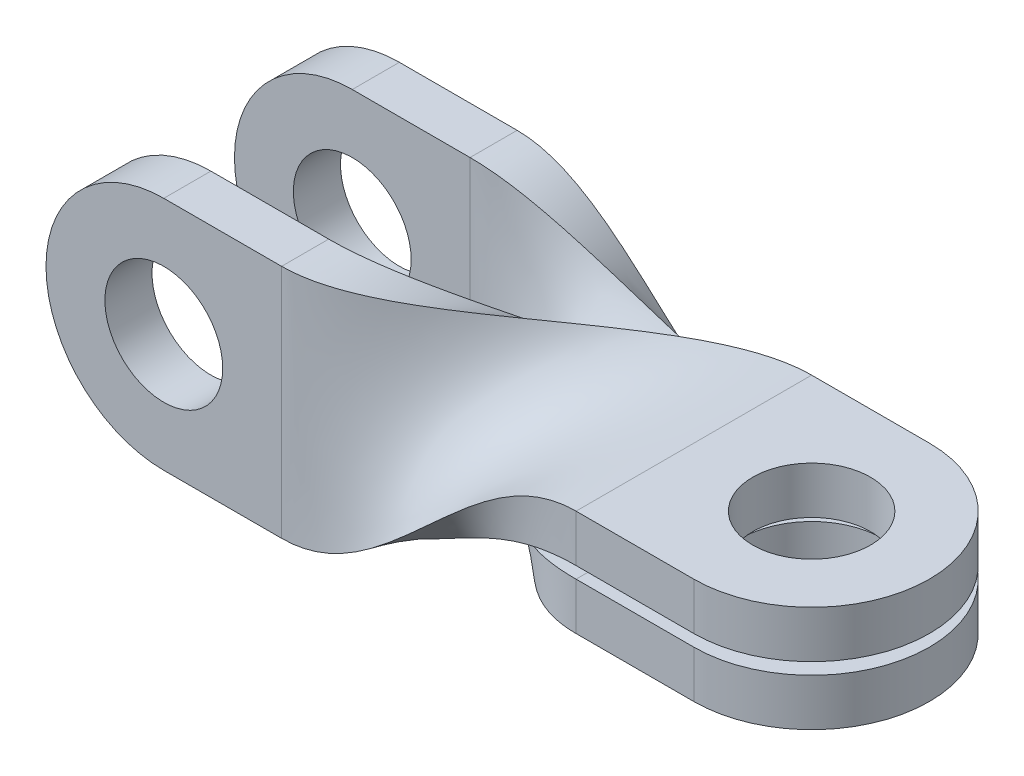
ISO-10303-21;
HEADER;
FILE_DESCRIPTION(('STEP AP214'),'2;1');
FILE_NAME('part.step','',(''),(''),'','','');
FILE_SCHEMA(('AUTOMOTIVE_DESIGN { 1 0 10303 214 1 1 1 1 }'));
ENDSEC;
DATA;
#1=APPLICATION_CONTEXT('core data for automotive mechanical design processes');
#2=APPLICATION_PROTOCOL_DEFINITION('international standard','automotive_design',2000,#1);
#3=PRODUCT_CONTEXT('',#1,'mechanical');
#4=PRODUCT('Part','Part','',(#3));
#5=PRODUCT_RELATED_PRODUCT_CATEGORY('part','',(#4));
#6=PRODUCT_DEFINITION_FORMATION('','',#4);
#7=PRODUCT_DEFINITION_CONTEXT('part definition',#1,'design');
#8=PRODUCT_DEFINITION('design','',#6,#7);
#9=PRODUCT_DEFINITION_SHAPE('','',#8);
#10=(LENGTH_UNIT() NAMED_UNIT(*) SI_UNIT(.MILLI.,.METRE.));
#11=(NAMED_UNIT(*) PLANE_ANGLE_UNIT() SI_UNIT($,.RADIAN.));
#12=(NAMED_UNIT(*) SI_UNIT($,.STERADIAN.) SOLID_ANGLE_UNIT());
#13=UNCERTAINTY_MEASURE_WITH_UNIT(LENGTH_MEASURE(1.E-05),#10,'distance_accuracy_value','');
#14=(GEOMETRIC_REPRESENTATION_CONTEXT(3) GLOBAL_UNCERTAINTY_ASSIGNED_CONTEXT((#13)) GLOBAL_UNIT_ASSIGNED_CONTEXT((#10,
#11,#12)) REPRESENTATION_CONTEXT('',''));
#15=CARTESIAN_POINT('',(0.,0.,0.));
#16=DIRECTION('',(0.,0.,1.));
#17=DIRECTION('',(1.,0.,0.));
#18=AXIS2_PLACEMENT_3D('',#15,#16,#17);
#19=CARTESIAN_POINT('',(0.,-0.5,0.));
#20=DIRECTION('',(0.,1.,0.));
#21=DIRECTION('',(0.,0.,1.));
#22=AXIS2_PLACEMENT_3D('',#19,#20,#21);
#23=CYLINDRICAL_SURFACE('',#22,1.);
#24=CARTESIAN_POINT('',(0.,-0.1,0.));
#25=DIRECTION('',(0.,1.,0.));
#26=DIRECTION('',(0.,0.,1.));
#27=AXIS2_PLACEMENT_3D('',#24,#25,#26);
#28=CIRCLE('',#27,1.);
#29=CARTESIAN_POINT('',(0.,-0.1,1.));
#30=VERTEX_POINT('',#29);
#31=CARTESIAN_POINT('',(0.,-0.1,-1.));
#32=VERTEX_POINT('',#31);
#33=EDGE_CURVE('E594',#30,#32,#28,.T.);
#34=ORIENTED_EDGE('',*,*,#33,.F.);
#35=DIRECTION('',(0.,1.,0.));
#36=VECTOR('',#35,1.);
#37=CARTESIAN_POINT('',(0.,-0.5,1.));
#38=LINE('',#37,#36);
#39=CARTESIAN_POINT('',(0.,-0.5,1.));
#40=VERTEX_POINT('',#39);
#41=EDGE_CURVE('E14',#40,#30,#38,.T.);
#42=ORIENTED_EDGE('',*,*,#41,.F.);
#43=CARTESIAN_POINT('',(0.,-0.5,0.));
#44=DIRECTION('',(0.,1.,0.));
#45=DIRECTION('',(0.,0.,1.));
#46=AXIS2_PLACEMENT_3D('',#43,#44,#45);
#47=CIRCLE('',#46,1.);
#48=CARTESIAN_POINT('',(0.,-0.5,-1.));
#49=VERTEX_POINT('',#48);
#50=EDGE_CURVE('E582',#40,#49,#47,.T.);
#51=ORIENTED_EDGE('',*,*,#50,.T.);
#52=DIRECTION('',(0.,1.,0.));
#53=VECTOR('',#52,1.);
#54=CARTESIAN_POINT('',(0.,-0.5,-1.));
#55=LINE('',#54,#53);
#56=EDGE_CURVE('E570',#49,#32,#55,.T.);
#57=ORIENTED_EDGE('',*,*,#56,.T.);
#58=EDGE_LOOP('',(#34,#42,#51,#57));
#59=FACE_BOUND('',#58,.T.);
#60=ADVANCED_FACE('F526',(#59),#23,.T.);
#61=CARTESIAN_POINT('',(-1.,-0.5,1.));
#62=DIRECTION('',(0.,0.,1.));
#63=DIRECTION('',(1.,0.,0.));
#64=AXIS2_PLACEMENT_3D('',#61,#62,#63);
#65=PLANE('',#64);
#66=DIRECTION('',(1.,0.,0.));
#67=VECTOR('',#66,1.);
#68=CARTESIAN_POINT('',(-1.,-0.1,1.));
#69=LINE('',#68,#67);
#70=CARTESIAN_POINT('',(-1.,-0.1,1.));
#71=VERTEX_POINT('',#70);
#72=EDGE_CURVE('E585',#71,#30,#69,.T.);
#73=ORIENTED_EDGE('',*,*,#72,.F.);
#74=DIRECTION('',(0.,1.,0.));
#75=VECTOR('',#74,1.);
#76=CARTESIAN_POINT('',(-1.,-0.5,1.));
#77=LINE('',#76,#75);
#78=CARTESIAN_POINT('',(-1.,-0.5,1.));
#79=VERTEX_POINT('',#78);
#80=EDGE_CURVE('E536',#79,#71,#77,.T.);
#81=ORIENTED_EDGE('',*,*,#80,.F.);
#82=DIRECTION('',(1.,0.,0.));
#83=VECTOR('',#82,1.);
#84=CARTESIAN_POINT('',(-1.,-0.5,1.));
#85=LINE('',#84,#83);
#86=EDGE_CURVE('E579',#79,#40,#85,.T.);
#87=ORIENTED_EDGE('',*,*,#86,.T.);
#88=ORIENTED_EDGE('',*,*,#41,.T.);
#89=EDGE_LOOP('',(#73,#81,#87,#88));
#90=FACE_BOUND('',#89,.T.);
#91=ADVANCED_FACE('F839',(#90),#65,.T.);
#92=CARTESIAN_POINT('',(0.,-0.5,-1.));
#93=DIRECTION('',(0.,0.,-1.));
#94=DIRECTION('',(-1.,0.,0.));
#95=AXIS2_PLACEMENT_3D('',#92,#93,#94);
#96=PLANE('',#95);
#97=DIRECTION('',(-1.,0.,0.));
#98=VECTOR('',#97,1.);
#99=CARTESIAN_POINT('',(0.,-0.1,-1.));
#100=LINE('',#99,#98);
#101=CARTESIAN_POINT('',(-1.,-0.100000000000001,-0.999999999999999));
#102=VERTEX_POINT('',#101);
#103=EDGE_CURVE('E576',#32,#102,#100,.T.);
#104=ORIENTED_EDGE('',*,*,#103,.F.);
#105=ORIENTED_EDGE('',*,*,#56,.F.);
#106=DIRECTION('',(-1.,0.,0.));
#107=VECTOR('',#106,1.);
#108=CARTESIAN_POINT('',(0.,-0.5,-1.));
#109=LINE('',#108,#107);
#110=CARTESIAN_POINT('',(-1.,-0.5,-0.999999999999999));
#111=VERTEX_POINT('',#110);
#112=EDGE_CURVE('E573',#49,#111,#109,.T.);
#113=ORIENTED_EDGE('',*,*,#112,.T.);
#114=DIRECTION('',(0.,1.,0.));
#115=VECTOR('',#114,1.);
#116=CARTESIAN_POINT('',(-1.,-0.5,-1.));
#117=LINE('',#116,#115);
#118=EDGE_CURVE('E578',#111,#102,#117,.T.);
#119=ORIENTED_EDGE('',*,*,#118,.T.);
#120=EDGE_LOOP('',(#104,#105,#113,#119));
#121=FACE_BOUND('',#120,.T.);
#122=ADVANCED_FACE('F571',(#121),#96,.T.);
#123=CARTESIAN_POINT('',(0.,-0.5,0.));
#124=DIRECTION('',(0.,1.,0.));
#125=DIRECTION('',(0.,0.,1.));
#126=AXIS2_PLACEMENT_3D('',#123,#124,#125);
#127=PLANE('',#126);
#128=CARTESIAN_POINT('',(0.,-0.5,0.));
#129=DIRECTION('',(0.,1.,0.));
#130=DIRECTION('',(0.,0.,1.));
#131=AXIS2_PLACEMENT_3D('',#128,#129,#130);
#132=CIRCLE('',#131,0.6);
#133=CARTESIAN_POINT('',(0.,-0.5,0.6));
#134=VERTEX_POINT('',#133);
#135=EDGE_CURVE('E595',#134,#134,#132,.T.);
#136=ORIENTED_EDGE('',*,*,#135,.T.);
#137=EDGE_LOOP('',(#136));
#138=FACE_BOUND('',#137,.T.);
#139=ORIENTED_EDGE('',*,*,#50,.F.);
#140=ORIENTED_EDGE('',*,*,#86,.F.);
#141=DIRECTION('',(0.,0.,1.));
#142=VECTOR('',#141,1.);
#143=CARTESIAN_POINT('',(-1.,-0.5,0.));
#144=LINE('',#143,#142);
#145=EDGE_CURVE('E565',#111,#79,#144,.T.);
#146=ORIENTED_EDGE('',*,*,#145,.F.);
#147=ORIENTED_EDGE('',*,*,#112,.F.);
#148=EDGE_LOOP('',(#139,#140,#146,#147));
#149=FACE_BOUND('',#148,.T.);
#150=ADVANCED_FACE('F581',(#138,#149),#127,.F.);
#151=CARTESIAN_POINT('',(0.,-0.1,0.));
#152=DIRECTION('',(0.,1.,0.));
#153=DIRECTION('',(0.,0.,1.));
#154=AXIS2_PLACEMENT_3D('',#151,#152,#153);
#155=PLANE('',#154);
#156=CARTESIAN_POINT('',(0.,-0.1,0.));
#157=DIRECTION('',(0.,1.,0.));
#158=DIRECTION('',(0.,0.,1.));
#159=AXIS2_PLACEMENT_3D('',#156,#157,#158);
#160=CIRCLE('',#159,0.6);
#161=CARTESIAN_POINT('',(0.,-0.1,0.6));
#162=VERTEX_POINT('',#161);
#163=EDGE_CURVE('E592',#162,#162,#160,.T.);
#164=ORIENTED_EDGE('',*,*,#163,.F.);
#165=EDGE_LOOP('',(#164));
#166=FACE_BOUND('',#165,.T.);
#167=ORIENTED_EDGE('',*,*,#33,.T.);
#168=ORIENTED_EDGE('',*,*,#103,.T.);
#169=DIRECTION('',(0.,0.,1.));
#170=VECTOR('',#169,1.);
#171=CARTESIAN_POINT('',(-1.,-0.1,0.));
#172=LINE('',#171,#170);
#173=EDGE_CURVE('E588',#102,#71,#172,.T.);
#174=ORIENTED_EDGE('',*,*,#173,.T.);
#175=ORIENTED_EDGE('',*,*,#72,.T.);
#176=EDGE_LOOP('',(#167,#168,#174,#175));
#177=FACE_BOUND('',#176,.T.);
#178=ADVANCED_FACE('F837',(#166,#177),#155,.T.);
#179=CARTESIAN_POINT('',(0.,-0.5,0.));
#180=DIRECTION('',(0.,1.,0.));
#181=DIRECTION('',(0.,0.,1.));
#182=AXIS2_PLACEMENT_3D('',#179,#180,#181);
#183=CYLINDRICAL_SURFACE('',#182,0.6);
#184=ORIENTED_EDGE('',*,*,#135,.F.);
#185=EDGE_LOOP('',(#184));
#186=FACE_BOUND('',#185,.T.);
#187=ORIENTED_EDGE('',*,*,#163,.T.);
#188=EDGE_LOOP('',(#187));
#189=FACE_BOUND('',#188,.T.);
#190=ADVANCED_FACE('F789',(#186,#189),#183,.F.);
#191=CARTESIAN_POINT('',(-3.5,0.949999999999999,-1.));
#192=CARTESIAN_POINT('',(-2.58865282600193,0.95,-1.));
#193=CARTESIAN_POINT('',(-1.91134717399807,-0.5,-0.999999999999999));
#194=CARTESIAN_POINT('',(-1.,-0.5,-1.));
#195=CARTESIAN_POINT('',(-3.5,0.949999999999999,-0.933333333333333));
#196=CARTESIAN_POINT('',(-2.59495036780708,0.95,-0.933333333333333));
#197=CARTESIAN_POINT('',(-1.90504963219292,-0.433333333333333,-0.999999999999999));
#198=CARTESIAN_POINT('',(-1.,-0.433333333333333,-1.));
#199=CARTESIAN_POINT('',(-3.5,0.949999999999999,-0.8));
#200=CARTESIAN_POINT('',(-2.60754545141739,0.95,-0.8));
#201=CARTESIAN_POINT('',(-1.89245454858261,-0.3,-0.999999999999999));
#202=CARTESIAN_POINT('',(-1.,-0.3,-1.));
#203=CARTESIAN_POINT('',(-3.5,0.949999999999999,-0.666666666666667));
#204=CARTESIAN_POINT('',(-2.61484039295249,0.95,-0.666666666666667));
#205=CARTESIAN_POINT('',(-1.88515960704751,-0.166666666666667,-0.999999999999999));
#206=CARTESIAN_POINT('',(-1.,-0.166666666666667,-1.));
#207=CARTESIAN_POINT('',(-3.5,0.949999999999999,-0.6));
#208=CARTESIAN_POINT('',(-2.61848786372004,0.95,-0.6));
#209=CARTESIAN_POINT('',(-1.88151213627996,-0.1,-0.999999999999999));
#210=CARTESIAN_POINT('',(-1.,-0.1,-1.));
#211=B_SPLINE_SURFACE_WITH_KNOTS('',3,3,((#191,#192,#193,#194),(#195,#196,#197,#198),(#199,#200,
#201,#202),(#203,#204,#205,#206),(#207,#208,#209,#210)),.UNSPECIFIED.,.F.,.F.,.F.,(4,1,4),(4,4),
(0.,0.5,1.),(0.,1.),.UNSPECIFIED.);
#212=DIRECTION('',(0.,0.,1.));
#213=VECTOR('',#212,1.);
#214=CARTESIAN_POINT('',(-3.5,0.949999999999999,-1.));
#215=LINE('',#214,#213);
#216=CARTESIAN_POINT('',(-3.5,0.949999999999999,-1.));
#217=VERTEX_POINT('',#216);
#218=CARTESIAN_POINT('',(-3.5,0.949999999999999,-0.6));
#219=VERTEX_POINT('',#218);
#220=EDGE_CURVE('E662',#217,#219,#215,.T.);
#221=CARTESIAN_POINT('',(-3.5,0.949999999999999,-0.6));
#222=CARTESIAN_POINT('',(-2.61848786372004,0.95,-0.6));
#223=CARTESIAN_POINT('',(-1.88151213627996,-0.1,-0.999999999999999));
#224=CARTESIAN_POINT('',(-1.,-0.1,-1.));
#225=B_SPLINE_CURVE_WITH_KNOTS('',3,(#221,#222,#223,#224),.UNSPECIFIED.,.F.,.F.,(4,4),(0.,1.),.UNSPECIFIED.);
#226=EDGE_CURVE('E729',#219,#102,#225,.T.);
#227=CARTESIAN_POINT('',(-3.5,0.949999999999999,-1.));
#228=CARTESIAN_POINT('',(-2.58865282600193,0.95,-1.));
#229=CARTESIAN_POINT('',(-1.91134717399807,-0.5,-0.999999999999999));
#230=CARTESIAN_POINT('',(-1.,-0.5,-1.));
#231=B_SPLINE_CURVE_WITH_KNOTS('',3,(#227,#228,#229,#230),.UNSPECIFIED.,.F.,.F.,(4,4),(0.,1.),.UNSPECIFIED.);
#232=EDGE_CURVE('E671',#111,#217,#231,.F.);
#233=ORIENTED_EDGE('',*,*,#220,.T.);
#234=ORIENTED_EDGE('',*,*,#226,.T.);
#235=ORIENTED_EDGE('',*,*,#118,.F.);
#236=ORIENTED_EDGE('',*,*,#232,.T.);
#237=EDGE_LOOP('',(#233,#234,#235,#236));
#238=FACE_BOUND('',#237,.T.);
#239=ADVANCED_FACE('F650',(#238),#211,.T.);
#240=CARTESIAN_POINT('',(-3.5,0.949999999999999,-0.6));
#241=CARTESIAN_POINT('',(-2.61848786372004,0.95,-0.6));
#242=CARTESIAN_POINT('',(-1.88151213627996,-0.1,-0.999999999999999));
#243=CARTESIAN_POINT('',(-1.,-0.1,-1.));
#244=CARTESIAN_POINT('',(-3.5,0.616666666666666,-0.6));
#245=CARTESIAN_POINT('',(-2.64168935434281,0.616666666666666,-0.6));
#246=CARTESIAN_POINT('',(-1.85831064565719,-0.1,-0.666666666666666));
#247=CARTESIAN_POINT('',(-1.,-0.1,-0.666666666666666));
#248=CARTESIAN_POINT('',(-3.5,-0.0500000000000006,-0.6));
#249=CARTESIAN_POINT('',(-2.68809233558837,-0.0499999999999998,-0.6));
#250=CARTESIAN_POINT('',(-1.81190766441163,-0.1,0.));
#251=CARTESIAN_POINT('',(-1.,-0.1,0.));
#252=CARTESIAN_POINT('',(-3.5,-0.716666666666667,-0.6));
#253=CARTESIAN_POINT('',(-2.5916101018473,-0.716666666666667,-0.6));
#254=CARTESIAN_POINT('',(-1.9083898981527,-0.1,0.666666666666666));
#255=CARTESIAN_POINT('',(-1.,-0.1,0.666666666666666));
#256=CARTESIAN_POINT('',(-3.5,-1.05,-0.6));
#257=CARTESIAN_POINT('',(-2.54336898497677,-1.05,-0.6));
#258=CARTESIAN_POINT('',(-1.95663101502323,-0.1,0.999999999999999));
#259=CARTESIAN_POINT('',(-1.,-0.1,1.));
#260=B_SPLINE_SURFACE_WITH_KNOTS('',3,3,((#240,#241,#242,#243),(#244,#245,#246,#247),(#248,#249,
#250,#251),(#252,#253,#254,#255),(#256,#257,#258,#259)),.UNSPECIFIED.,.F.,.F.,.F.,(4,1,4),(4,4),
(0.,0.5,1.),(0.,1.),.UNSPECIFIED.);
#261=DIRECTION('',(0.,1.,0.));
#262=VECTOR('',#261,1.);
#263=CARTESIAN_POINT('',(-3.5,0.949999999999999,-0.6));
#264=LINE('',#263,#262);
#265=CARTESIAN_POINT('',(-3.5,-1.05,-0.6));
#266=VERTEX_POINT('',#265);
#267=EDGE_CURVE('E529',#266,#219,#264,.T.);
#268=CARTESIAN_POINT('',(-3.5,-1.05,-0.6));
#269=CARTESIAN_POINT('',(-2.54336898497677,-1.05,-0.6));
#270=CARTESIAN_POINT('',(-1.95663101502323,-0.1,0.999999999999999));
#271=CARTESIAN_POINT('',(-1.,-0.1,1.));
#272=B_SPLINE_CURVE_WITH_KNOTS('',3,(#268,#269,#270,#271),.UNSPECIFIED.,.F.,.F.,(4,4),(0.,1.),.UNSPECIFIED.);
#273=EDGE_CURVE('E738',#266,#71,#272,.T.);
#274=ORIENTED_EDGE('',*,*,#267,.F.);
#275=ORIENTED_EDGE('',*,*,#273,.T.);
#276=ORIENTED_EDGE('',*,*,#173,.F.);
#277=ORIENTED_EDGE('',*,*,#226,.F.);
#278=EDGE_LOOP('',(#274,#275,#276,#277));
#279=FACE_BOUND('',#278,.T.);
#280=ADVANCED_FACE('F756',(#279),#260,.T.);
#281=CARTESIAN_POINT('',(-3.5,-1.05,-1.));
#282=CARTESIAN_POINT('',(-2.51697443183543,-1.05,-1.));
#283=CARTESIAN_POINT('',(-1.98302556816456,-0.5,0.999999999999999));
#284=CARTESIAN_POINT('',(-1.,-0.5,1.));
#285=CARTESIAN_POINT('',(-3.5,-0.716666666666667,-1.));
#286=CARTESIAN_POINT('',(-2.5628546758428,-0.716666666666668,-1.));
#287=CARTESIAN_POINT('',(-1.9371453241572,-0.5,0.666666666666666));
#288=CARTESIAN_POINT('',(-1.,-0.5,0.666666666666666));
#289=CARTESIAN_POINT('',(-3.5,-0.0500000000000006,-1.));
#290=CARTESIAN_POINT('',(-2.65461516385754,-0.0500000000000015,-1.));
#291=CARTESIAN_POINT('',(-1.84538483614246,-0.5,0.));
#292=CARTESIAN_POINT('',(-1.,-0.5,0.));
#293=CARTESIAN_POINT('',(-3.5,0.616666666666666,-1.));
#294=CARTESIAN_POINT('',(-2.6106402719538,0.616666666666666,-1.));
#295=CARTESIAN_POINT('',(-1.8893597280462,-0.5,-0.666666666666666));
#296=CARTESIAN_POINT('',(-1.,-0.5,-0.666666666666666));
#297=CARTESIAN_POINT('',(-3.5,0.949999999999999,-1.));
#298=CARTESIAN_POINT('',(-2.58865282600193,0.95,-1.));
#299=CARTESIAN_POINT('',(-1.91134717399807,-0.5,-0.999999999999999));
#300=CARTESIAN_POINT('',(-1.,-0.5,-1.));
#301=B_SPLINE_SURFACE_WITH_KNOTS('',3,3,((#281,#282,#283,#284),(#285,#286,#287,#288),(#289,#290,
#291,#292),(#293,#294,#295,#296),(#297,#298,#299,#300)),.UNSPECIFIED.,.F.,.F.,.F.,(4,1,4),(4,4),
(0.,0.5,1.),(0.,1.),.UNSPECIFIED.);
#302=DIRECTION('',(0.,1.,0.));
#303=VECTOR('',#302,1.);
#304=CARTESIAN_POINT('',(-3.5,0.949999999999999,-1.));
#305=LINE('',#304,#303);
#306=CARTESIAN_POINT('',(-3.5,-1.05,-1.));
#307=VERTEX_POINT('',#306);
#308=EDGE_CURVE('E672',#307,#217,#305,.T.);
#309=CARTESIAN_POINT('',(-3.5,-1.05,-1.));
#310=CARTESIAN_POINT('',(-2.51697443183543,-1.05,-1.));
#311=CARTESIAN_POINT('',(-1.98302556816456,-0.5,1.));
#312=CARTESIAN_POINT('',(-1.,-0.5,1.));
#313=B_SPLINE_CURVE_WITH_KNOTS('',3,(#309,#310,#311,#312),.UNSPECIFIED.,.F.,.F.,(4,4),(0.,1.),.UNSPECIFIED.);
#314=EDGE_CURVE('E801',#307,#79,#313,.T.);
#315=ORIENTED_EDGE('',*,*,#308,.T.);
#316=ORIENTED_EDGE('',*,*,#232,.F.);
#317=ORIENTED_EDGE('',*,*,#145,.T.);
#318=ORIENTED_EDGE('',*,*,#314,.F.);
#319=EDGE_LOOP('',(#315,#316,#317,#318));
#320=FACE_BOUND('',#319,.T.);
#321=ADVANCED_FACE('F766',(#320),#301,.T.);
#322=CARTESIAN_POINT('',(-3.5,-1.05,-0.6));
#323=CARTESIAN_POINT('',(-2.54336898497677,-1.05,-0.6));
#324=CARTESIAN_POINT('',(-1.95663101502323,-0.1,1.));
#325=CARTESIAN_POINT('',(-1.,-0.1,1.));
#326=CARTESIAN_POINT('',(-3.5,-1.05,-0.666666666666667));
#327=CARTESIAN_POINT('',(-2.54016059466707,-1.05,-0.666666666666667));
#328=CARTESIAN_POINT('',(-1.95983940533292,-0.166666666666667,1.));
#329=CARTESIAN_POINT('',(-1.,-0.166666666666667,1.));
#330=CARTESIAN_POINT('',(-3.5,-1.05,-0.8));
#331=CARTESIAN_POINT('',(-2.53374381404769,-1.05,-0.8));
#332=CARTESIAN_POINT('',(-1.96625618595231,-0.3,1.));
#333=CARTESIAN_POINT('',(-1.,-0.3,1.));
#334=CARTESIAN_POINT('',(-3.5,-1.05,-0.933333333333333));
#335=CARTESIAN_POINT('',(-2.52256422590618,-1.05,-0.933333333333333));
#336=CARTESIAN_POINT('',(-1.97743577409381,-0.433333333333333,1.));
#337=CARTESIAN_POINT('',(-1.,-0.433333333333333,1.));
#338=CARTESIAN_POINT('',(-3.5,-1.05,-1.));
#339=CARTESIAN_POINT('',(-2.51697443183543,-1.05,-1.));
#340=CARTESIAN_POINT('',(-1.98302556816456,-0.5,1.));
#341=CARTESIAN_POINT('',(-1.,-0.5,1.));
#342=B_SPLINE_SURFACE_WITH_KNOTS('',3,3,((#322,#323,#324,#325),(#326,#327,#328,#329),(#330,#331,
#332,#333),(#334,#335,#336,#337),(#338,#339,#340,#341)),.UNSPECIFIED.,.F.,.F.,.F.,(4,1,4),(4,4),
(0.,0.5,1.),(0.,1.),.UNSPECIFIED.);
#343=DIRECTION('',(0.,0.,1.));
#344=VECTOR('',#343,1.);
#345=CARTESIAN_POINT('',(-3.5,-1.05,-1.));
#346=LINE('',#345,#344);
#347=EDGE_CURVE('E619',#307,#266,#346,.T.);
#348=ORIENTED_EDGE('',*,*,#347,.F.);
#349=ORIENTED_EDGE('',*,*,#314,.T.);
#350=ORIENTED_EDGE('',*,*,#80,.T.);
#351=ORIENTED_EDGE('',*,*,#273,.F.);
#352=EDGE_LOOP('',(#348,#349,#350,#351));
#353=FACE_BOUND('',#352,.T.);
#354=ADVANCED_FACE('F648',(#353),#342,.T.);
#355=CARTESIAN_POINT('',(-3.5,0.949999999999999,-1.));
#356=DIRECTION('',(0.,1.,0.));
#357=DIRECTION('',(-1.,0.,0.));
#358=AXIS2_PLACEMENT_3D('',#355,#356,#357);
#359=PLANE('',#358);
#360=DIRECTION('',(-1.,0.,0.));
#361=VECTOR('',#360,1.);
#362=CARTESIAN_POINT('',(-3.5,0.949999999999999,-0.6));
#363=LINE('',#362,#361);
#364=CARTESIAN_POINT('',(-4.5,0.95,-0.6));
#365=VERTEX_POINT('',#364);
#366=EDGE_CURVE('E673',#219,#365,#363,.T.);
#367=ORIENTED_EDGE('',*,*,#366,.F.);
#368=ORIENTED_EDGE('',*,*,#220,.F.);
#369=DIRECTION('',(-1.,0.,0.));
#370=VECTOR('',#369,1.);
#371=CARTESIAN_POINT('',(-3.5,0.949999999999999,-1.));
#372=LINE('',#371,#370);
#373=CARTESIAN_POINT('',(-4.5,0.95,-1.));
#374=VERTEX_POINT('',#373);
#375=EDGE_CURVE('E608',#217,#374,#372,.T.);
#376=ORIENTED_EDGE('',*,*,#375,.T.);
#377=DIRECTION('',(0.,0.,1.));
#378=VECTOR('',#377,1.);
#379=CARTESIAN_POINT('',(-4.5,0.95,-1.));
#380=LINE('',#379,#378);
#381=EDGE_CURVE('E705',#374,#365,#380,.T.);
#382=ORIENTED_EDGE('',*,*,#381,.T.);
#383=EDGE_LOOP('',(#367,#368,#376,#382));
#384=FACE_BOUND('',#383,.T.);
#385=ADVANCED_FACE('F637',(#384),#359,.T.);
#386=CARTESIAN_POINT('',(-4.5,-1.05,-1.));
#387=DIRECTION('',(0.,-1.,0.));
#388=DIRECTION('',(1.,0.,0.));
#389=AXIS2_PLACEMENT_3D('',#386,#387,#388);
#390=PLANE('',#389);
#391=DIRECTION('',(1.,0.,0.));
#392=VECTOR('',#391,1.);
#393=CARTESIAN_POINT('',(-4.5,-1.05,-0.6));
#394=LINE('',#393,#392);
#395=CARTESIAN_POINT('',(-4.5,-1.05,-0.6));
#396=VERTEX_POINT('',#395);
#397=EDGE_CURVE('E605',#396,#266,#394,.T.);
#398=ORIENTED_EDGE('',*,*,#397,.F.);
#399=DIRECTION('',(0.,0.,1.));
#400=VECTOR('',#399,1.);
#401=CARTESIAN_POINT('',(-4.5,-1.05,-1.));
#402=LINE('',#401,#400);
#403=CARTESIAN_POINT('',(-4.5,-1.05,-1.));
#404=VERTEX_POINT('',#403);
#405=EDGE_CURVE('E712',#404,#396,#402,.T.);
#406=ORIENTED_EDGE('',*,*,#405,.F.);
#407=DIRECTION('',(1.,0.,0.));
#408=VECTOR('',#407,1.);
#409=CARTESIAN_POINT('',(-4.5,-1.05,-1.));
#410=LINE('',#409,#408);
#411=EDGE_CURVE('E699',#404,#307,#410,.T.);
#412=ORIENTED_EDGE('',*,*,#411,.T.);
#413=ORIENTED_EDGE('',*,*,#347,.T.);
#414=EDGE_LOOP('',(#398,#406,#412,#413));
#415=FACE_BOUND('',#414,.T.);
#416=ADVANCED_FACE('F626',(#415),#390,.T.);
#417=CARTESIAN_POINT('',(-4.5,-0.0500000000000005,-1.));
#418=DIRECTION('',(0.,0.,1.));
#419=DIRECTION('',(1.,0.,0.));
#420=AXIS2_PLACEMENT_3D('',#417,#418,#419);
#421=CYLINDRICAL_SURFACE('',#420,1.);
#422=CARTESIAN_POINT('',(-4.5,-0.0500000000000005,-0.6));
#423=DIRECTION('',(0.,0.,1.));
#424=DIRECTION('',(-1.,0.,0.));
#425=AXIS2_PLACEMENT_3D('',#422,#423,#424);
#426=CIRCLE('',#425,1.);
#427=EDGE_CURVE('E609',#365,#396,#426,.T.);
#428=ORIENTED_EDGE('',*,*,#427,.F.);
#429=ORIENTED_EDGE('',*,*,#381,.F.);
#430=CARTESIAN_POINT('',(-4.5,-0.0500000000000005,-1.));
#431=DIRECTION('',(0.,0.,1.));
#432=DIRECTION('',(-1.,0.,0.));
#433=AXIS2_PLACEMENT_3D('',#430,#431,#432);
#434=CIRCLE('',#433,1.);
#435=EDGE_CURVE('E693',#374,#404,#434,.T.);
#436=ORIENTED_EDGE('',*,*,#435,.T.);
#437=ORIENTED_EDGE('',*,*,#405,.T.);
#438=EDGE_LOOP('',(#428,#429,#436,#437));
#439=FACE_BOUND('',#438,.T.);
#440=ADVANCED_FACE('F636',(#439),#421,.T.);
#441=CARTESIAN_POINT('',(-4.5,-0.0500000000000005,-1.));
#442=DIRECTION('',(0.,0.,-1.));
#443=DIRECTION('',(-1.,0.,0.));
#444=AXIS2_PLACEMENT_3D('',#441,#442,#443);
#445=PLANE('',#444);
#446=CARTESIAN_POINT('',(-4.5,-0.0500000000000005,-1.));
#447=DIRECTION('',(0.,0.,1.));
#448=DIRECTION('',(1.,0.,0.));
#449=AXIS2_PLACEMENT_3D('',#446,#447,#448);
#450=CIRCLE('',#449,0.5);
#451=CARTESIAN_POINT('',(-4.,-0.0500000000000005,-1.));
#452=VERTEX_POINT('',#451);
#453=EDGE_CURVE('E850',#452,#452,#450,.T.);
#454=ORIENTED_EDGE('',*,*,#453,.T.);
#455=EDGE_LOOP('',(#454));
#456=FACE_BOUND('',#455,.T.);
#457=ORIENTED_EDGE('',*,*,#375,.F.);
#458=ORIENTED_EDGE('',*,*,#308,.F.);
#459=ORIENTED_EDGE('',*,*,#411,.F.);
#460=ORIENTED_EDGE('',*,*,#435,.F.);
#461=EDGE_LOOP('',(#457,#458,#459,#460));
#462=FACE_BOUND('',#461,.T.);
#463=ADVANCED_FACE('F643',(#456,#462),#445,.T.);
#464=CARTESIAN_POINT('',(-4.5,-0.0500000000000005,-0.6));
#465=DIRECTION('',(0.,0.,-1.));
#466=DIRECTION('',(-1.,0.,0.));
#467=AXIS2_PLACEMENT_3D('',#464,#465,#466);
#468=PLANE('',#467);
#469=CARTESIAN_POINT('',(-4.5,-0.0500000000000005,-0.6));
#470=DIRECTION('',(0.,0.,1.));
#471=DIRECTION('',(1.,0.,0.));
#472=AXIS2_PLACEMENT_3D('',#469,#470,#471);
#473=CIRCLE('',#472,0.5);
#474=CARTESIAN_POINT('',(-4.,-0.0500000000000005,-0.6));
#475=VERTEX_POINT('',#474);
#476=EDGE_CURVE('E708',#475,#475,#473,.T.);
#477=ORIENTED_EDGE('',*,*,#476,.F.);
#478=EDGE_LOOP('',(#477));
#479=FACE_BOUND('',#478,.T.);
#480=ORIENTED_EDGE('',*,*,#366,.T.);
#481=ORIENTED_EDGE('',*,*,#427,.T.);
#482=ORIENTED_EDGE('',*,*,#397,.T.);
#483=ORIENTED_EDGE('',*,*,#267,.T.);
#484=EDGE_LOOP('',(#480,#481,#482,#483));
#485=FACE_BOUND('',#484,.T.);
#486=ADVANCED_FACE('F638',(#479,#485),#468,.F.);
#487=CARTESIAN_POINT('',(-4.5,-0.0500000000000005,-1.));
#488=DIRECTION('',(0.,0.,1.));
#489=DIRECTION('',(1.,0.,0.));
#490=AXIS2_PLACEMENT_3D('',#487,#488,#489);
#491=CYLINDRICAL_SURFACE('',#490,0.5);
#492=ORIENTED_EDGE('',*,*,#453,.F.);
#493=EDGE_LOOP('',(#492));
#494=FACE_BOUND('',#493,.T.);
#495=ORIENTED_EDGE('',*,*,#476,.T.);
#496=EDGE_LOOP('',(#495));
#497=FACE_BOUND('',#496,.T.);
#498=ADVANCED_FACE('F857',(#494,#497),#491,.F.);
#499=CLOSED_SHELL('',(#60,#91,#122,#150,#178,#190,#239,#280,#321,#354,#385,#416,#440,#463,#486,#498));
#500=MANIFOLD_SOLID_BREP('B2',#499);
#501=CARTESIAN_POINT('',(0.,0.4,0.));
#502=DIRECTION('',(0.,1.,0.));
#503=DIRECTION('',(0.,0.,1.));
#504=AXIS2_PLACEMENT_3D('',#501,#502,#503);
#505=PLANE('',#504);
#506=CARTESIAN_POINT('',(0.,0.4,0.));
#507=DIRECTION('',(0.,1.,0.));
#508=DIRECTION('',(0.,0.,1.));
#509=AXIS2_PLACEMENT_3D('',#506,#507,#508);
#510=CIRCLE('',#509,1.);
#511=CARTESIAN_POINT('',(0.,0.4,1.));
#512=VERTEX_POINT('',#511);
#513=CARTESIAN_POINT('',(0.,0.4,-1.));
#514=VERTEX_POINT('',#513);
#515=EDGE_CURVE('E1305',#512,#514,#510,.T.);
#516=ORIENTED_EDGE('',*,*,#515,.T.);
#517=DIRECTION('',(-1.,0.,0.));
#518=VECTOR('',#517,1.);
#519=CARTESIAN_POINT('',(0.,0.4,-1.));
#520=LINE('',#519,#518);
#521=CARTESIAN_POINT('',(-1.,0.4,-1.));
#522=VERTEX_POINT('',#521);
#523=EDGE_CURVE('E1294',#514,#522,#520,.T.);
#524=ORIENTED_EDGE('',*,*,#523,.T.);
#525=DIRECTION('',(0.,0.,1.));
#526=VECTOR('',#525,1.);
#527=CARTESIAN_POINT('',(-1.,0.4,0.));
#528=LINE('',#527,#526);
#529=CARTESIAN_POINT('',(-1.,0.4,1.));
#530=VERTEX_POINT('',#529);
#531=EDGE_CURVE('E1304',#522,#530,#528,.T.);
#532=ORIENTED_EDGE('',*,*,#531,.T.);
#533=DIRECTION('',(1.,0.,0.));
#534=VECTOR('',#533,1.);
#535=CARTESIAN_POINT('',(-1.,0.4,1.));
#536=LINE('',#535,#534);
#537=EDGE_CURVE('E1275',#530,#512,#536,.T.);
#538=ORIENTED_EDGE('',*,*,#537,.T.);
#539=EDGE_LOOP('',(#516,#524,#532,#538));
#540=FACE_BOUND('',#539,.T.);
#541=CARTESIAN_POINT('',(0.,0.4,0.));
#542=DIRECTION('',(0.,1.,0.));
#543=DIRECTION('',(0.,0.,1.));
#544=AXIS2_PLACEMENT_3D('',#541,#542,#543);
#545=CIRCLE('',#544,0.5);
#546=CARTESIAN_POINT('',(0.,0.4,0.5));
#547=VERTEX_POINT('',#546);
#548=EDGE_CURVE('E1321',#547,#547,#545,.T.);
#549=ORIENTED_EDGE('',*,*,#548,.F.);
#550=EDGE_LOOP('',(#549));
#551=FACE_BOUND('',#550,.T.);
#552=ADVANCED_FACE('F1254',(#540,#551),#505,.T.);
#553=CARTESIAN_POINT('',(0.,0.,0.));
#554=DIRECTION('',(0.,1.,0.));
#555=DIRECTION('',(0.,0.,1.));
#556=AXIS2_PLACEMENT_3D('',#553,#554,#555);
#557=PLANE('',#556);
#558=CARTESIAN_POINT('',(0.,0.,0.));
#559=DIRECTION('',(0.,1.,0.));
#560=DIRECTION('',(0.,0.,1.));
#561=AXIS2_PLACEMENT_3D('',#558,#559,#560);
#562=CIRCLE('',#561,1.);
#563=CARTESIAN_POINT('',(0.,0.,1.));
#564=VERTEX_POINT('',#563);
#565=CARTESIAN_POINT('',(0.,0.,-1.));
#566=VERTEX_POINT('',#565);
#567=EDGE_CURVE('E1315',#564,#566,#562,.T.);
#568=ORIENTED_EDGE('',*,*,#567,.F.);
#569=DIRECTION('',(1.,0.,0.));
#570=VECTOR('',#569,1.);
#571=CARTESIAN_POINT('',(-1.,0.,1.));
#572=LINE('',#571,#570);
#573=CARTESIAN_POINT('',(-1.,0.,1.));
#574=VERTEX_POINT('',#573);
#575=EDGE_CURVE('E1312',#574,#564,#572,.T.);
#576=ORIENTED_EDGE('',*,*,#575,.F.);
#577=DIRECTION('',(0.,0.,1.));
#578=VECTOR('',#577,1.);
#579=CARTESIAN_POINT('',(-1.,0.,0.));
#580=LINE('',#579,#578);
#581=CARTESIAN_POINT('',(-1.,0.,-0.999999999999999));
#582=VERTEX_POINT('',#581);
#583=EDGE_CURVE('E1325',#582,#574,#580,.T.);
#584=ORIENTED_EDGE('',*,*,#583,.F.);
#585=DIRECTION('',(-1.,0.,0.));
#586=VECTOR('',#585,1.);
#587=CARTESIAN_POINT('',(0.,0.,-1.));
#588=LINE('',#587,#586);
#589=EDGE_CURVE('E1320',#566,#582,#588,.T.);
#590=ORIENTED_EDGE('',*,*,#589,.F.);
#591=EDGE_LOOP('',(#568,#576,#584,#590));
#592=FACE_BOUND('',#591,.T.);
#593=CARTESIAN_POINT('',(0.,0.,0.));
#594=DIRECTION('',(0.,1.,0.));
#595=DIRECTION('',(0.,0.,1.));
#596=AXIS2_PLACEMENT_3D('',#593,#594,#595);
#597=CIRCLE('',#596,0.5);
#598=CARTESIAN_POINT('',(0.,0.,0.5));
#599=VERTEX_POINT('',#598);
#600=EDGE_CURVE('E1328',#599,#599,#597,.T.);
#601=ORIENTED_EDGE('',*,*,#600,.T.);
#602=EDGE_LOOP('',(#601));
#603=FACE_BOUND('',#602,.T.);
#604=ADVANCED_FACE('F1492',(#592,#603),#557,.F.);
#605=CARTESIAN_POINT('',(0.,0.4,0.));
#606=DIRECTION('',(0.,-1.,0.));
#607=DIRECTION('',(0.,0.,-1.));
#608=AXIS2_PLACEMENT_3D('',#605,#606,#607);
#609=CYLINDRICAL_SURFACE('',#608,1.);
#610=ORIENTED_EDGE('',*,*,#567,.T.);
#611=DIRECTION('',(0.,-1.,0.));
#612=VECTOR('',#611,1.);
#613=CARTESIAN_POINT('',(0.,0.4,-1.));
#614=LINE('',#613,#612);
#615=EDGE_CURVE('E524',#514,#566,#614,.T.);
#616=ORIENTED_EDGE('',*,*,#615,.F.);
#617=ORIENTED_EDGE('',*,*,#515,.F.);
#618=DIRECTION('',(0.,-1.,0.));
#619=VECTOR('',#618,1.);
#620=CARTESIAN_POINT('',(0.,0.4,1.));
#621=LINE('',#620,#619);
#622=EDGE_CURVE('E1316',#512,#564,#621,.T.);
#623=ORIENTED_EDGE('',*,*,#622,.T.);
#624=EDGE_LOOP('',(#610,#616,#617,#623));
#625=FACE_BOUND('',#624,.T.);
#626=ADVANCED_FACE('F1256',(#625),#609,.T.);
#627=CARTESIAN_POINT('',(0.,0.4,-1.));
#628=DIRECTION('',(0.,0.,1.));
#629=DIRECTION('',(1.,0.,0.));
#630=AXIS2_PLACEMENT_3D('',#627,#628,#629);
#631=PLANE('',#630);
#632=ORIENTED_EDGE('',*,*,#589,.T.);
#633=DIRECTION('',(0.,1.,0.));
#634=VECTOR('',#633,1.);
#635=CARTESIAN_POINT('',(-1.,0.4,-1.));
#636=LINE('',#635,#634);
#637=EDGE_CURVE('E1266',#522,#582,#636,.F.);
#638=ORIENTED_EDGE('',*,*,#637,.F.);
#639=ORIENTED_EDGE('',*,*,#523,.F.);
#640=ORIENTED_EDGE('',*,*,#615,.T.);
#641=EDGE_LOOP('',(#632,#638,#639,#640));
#642=FACE_BOUND('',#641,.T.);
#643=ADVANCED_FACE('F1298',(#642),#631,.F.);
#644=CARTESIAN_POINT('',(-1.,0.4,1.));
#645=DIRECTION('',(0.,0.,-1.));
#646=DIRECTION('',(-1.,0.,0.));
#647=AXIS2_PLACEMENT_3D('',#644,#645,#646);
#648=PLANE('',#647);
#649=ORIENTED_EDGE('',*,*,#575,.T.);
#650=ORIENTED_EDGE('',*,*,#622,.F.);
#651=ORIENTED_EDGE('',*,*,#537,.F.);
#652=DIRECTION('',(0.,1.,0.));
#653=VECTOR('',#652,1.);
#654=CARTESIAN_POINT('',(-1.,0.4,1.));
#655=LINE('',#654,#653);
#656=EDGE_CURVE('E1333',#530,#574,#655,.F.);
#657=ORIENTED_EDGE('',*,*,#656,.T.);
#658=EDGE_LOOP('',(#649,#650,#651,#657));
#659=FACE_BOUND('',#658,.T.);
#660=ADVANCED_FACE('F1549',(#659),#648,.F.);
#661=CARTESIAN_POINT('',(0.,0.4,0.));
#662=DIRECTION('',(0.,-1.,0.));
#663=DIRECTION('',(0.,0.,-1.));
#664=AXIS2_PLACEMENT_3D('',#661,#662,#663);
#665=CYLINDRICAL_SURFACE('',#664,0.5);
#666=ORIENTED_EDGE('',*,*,#548,.T.);
#667=EDGE_LOOP('',(#666));
#668=FACE_BOUND('',#667,.T.);
#669=ORIENTED_EDGE('',*,*,#600,.F.);
#670=EDGE_LOOP('',(#669));
#671=FACE_BOUND('',#670,.T.);
#672=ADVANCED_FACE('F1391',(#668,#671),#665,.F.);
#673=CARTESIAN_POINT('',(-3.5,0.949999999999999,0.6));
#674=CARTESIAN_POINT('',(-2.54336898497677,0.95,0.6));
#675=CARTESIAN_POINT('',(-1.95663101502323,0.,-0.999999999999999));
#676=CARTESIAN_POINT('',(-1.,0.,-1.));
#677=CARTESIAN_POINT('',(-3.5,0.949999999999999,0.666666666666667));
#678=CARTESIAN_POINT('',(-2.54016059466708,0.95,0.666666666666667));
#679=CARTESIAN_POINT('',(-1.95983940533292,0.0666666666666667,-0.999999999999999));
#680=CARTESIAN_POINT('',(-1.,0.0666666666666667,-1.));
#681=CARTESIAN_POINT('',(-3.5,0.949999999999999,0.8));
#682=CARTESIAN_POINT('',(-2.53374381404769,0.95,0.8));
#683=CARTESIAN_POINT('',(-1.96625618595231,0.2,-0.999999999999999));
#684=CARTESIAN_POINT('',(-1.,0.2,-1.));
#685=CARTESIAN_POINT('',(-3.5,0.949999999999999,0.933333333333333));
#686=CARTESIAN_POINT('',(-2.52256422590619,0.95,0.933333333333333));
#687=CARTESIAN_POINT('',(-1.97743577409381,0.333333333333333,-0.999999999999999));
#688=CARTESIAN_POINT('',(-1.,0.333333333333333,-1.));
#689=CARTESIAN_POINT('',(-3.5,0.949999999999999,1.));
#690=CARTESIAN_POINT('',(-2.51697443183543,0.95,1.));
#691=CARTESIAN_POINT('',(-1.98302556816457,0.4,-0.999999999999999));
#692=CARTESIAN_POINT('',(-1.,0.4,-1.));
#693=B_SPLINE_SURFACE_WITH_KNOTS('',3,3,((#673,#674,#675,#676),(#677,#678,#679,#680),(#681,#682,
#683,#684),(#685,#686,#687,#688),(#689,#690,#691,#692)),.UNSPECIFIED.,.F.,.F.,.F.,(4,1,4),(4,4),
(0.,0.5,1.),(0.,1.),.UNSPECIFIED.);
#694=DIRECTION('',(0.,0.,-1.));
#695=VECTOR('',#694,1.);
#696=CARTESIAN_POINT('',(-3.5,0.949999999999999,1.));
#697=LINE('',#696,#695);
#698=CARTESIAN_POINT('',(-3.5,0.949999999999999,1.));
#699=VERTEX_POINT('',#698);
#700=CARTESIAN_POINT('',(-3.5,0.949999999999999,0.6));
#701=VERTEX_POINT('',#700);
#702=EDGE_CURVE('E1363',#699,#701,#697,.T.);
#703=CARTESIAN_POINT('',(-3.5,0.949999999999999,1.));
#704=CARTESIAN_POINT('',(-2.51697443183543,0.95,1.));
#705=CARTESIAN_POINT('',(-1.98302556816457,0.4,-0.999999999999999));
#706=CARTESIAN_POINT('',(-1.,0.4,-1.));
#707=B_SPLINE_CURVE_WITH_KNOTS('',3,(#703,#704,#705,#706),.UNSPECIFIED.,.F.,.F.,(4,4),(0.,1.),.UNSPECIFIED.);
#708=EDGE_CURVE('E1408',#699,#522,#707,.T.);
#709=CARTESIAN_POINT('',(-3.5,0.949999999999999,0.6));
#710=CARTESIAN_POINT('',(-2.54336898497677,0.95,0.6));
#711=CARTESIAN_POINT('',(-1.95663101502323,0.,-0.999999999999999));
#712=CARTESIAN_POINT('',(-1.,0.,-1.));
#713=B_SPLINE_CURVE_WITH_KNOTS('',3,(#709,#710,#711,#712),.UNSPECIFIED.,.F.,.F.,(4,4),(0.,1.),.UNSPECIFIED.);
#714=EDGE_CURVE('E1418',#582,#701,#713,.F.);
#715=ORIENTED_EDGE('',*,*,#702,.F.);
#716=ORIENTED_EDGE('',*,*,#708,.T.);
#717=ORIENTED_EDGE('',*,*,#637,.T.);
#718=ORIENTED_EDGE('',*,*,#714,.T.);
#719=EDGE_LOOP('',(#715,#716,#717,#718));
#720=FACE_BOUND('',#719,.T.);
#721=ADVANCED_FACE('F1384',(#720),#693,.T.);
#722=CARTESIAN_POINT('',(-3.5,0.949999999999999,1.));
#723=CARTESIAN_POINT('',(-2.51697443183543,0.95,1.));
#724=CARTESIAN_POINT('',(-1.98302556816457,0.4,-0.999999999999999));
#725=CARTESIAN_POINT('',(-1.,0.4,-1.));
#726=CARTESIAN_POINT('',(-3.5,0.616666666666666,1.));
#727=CARTESIAN_POINT('',(-2.5628546758428,0.616666666666666,1.));
#728=CARTESIAN_POINT('',(-1.9371453241572,0.4,-0.666666666666666));
#729=CARTESIAN_POINT('',(-1.,0.4,-0.666666666666666));
#730=CARTESIAN_POINT('',(-3.5,-0.0500000000000006,1.));
#731=CARTESIAN_POINT('',(-2.65461516385754,-0.0499999999999998,1.));
#732=CARTESIAN_POINT('',(-1.84538483614246,0.4,0.));
#733=CARTESIAN_POINT('',(-1.,0.4,0.));
#734=CARTESIAN_POINT('',(-3.5,-0.716666666666667,1.));
#735=CARTESIAN_POINT('',(-2.6106402719538,-0.716666666666667,1.));
#736=CARTESIAN_POINT('',(-1.8893597280462,0.4,0.666666666666666));
#737=CARTESIAN_POINT('',(-1.,0.4,0.666666666666666));
#738=CARTESIAN_POINT('',(-3.5,-1.05,1.));
#739=CARTESIAN_POINT('',(-2.58865282600193,-1.05,1.));
#740=CARTESIAN_POINT('',(-1.91134717399807,0.4,0.999999999999999));
#741=CARTESIAN_POINT('',(-1.,0.4,1.));
#742=B_SPLINE_SURFACE_WITH_KNOTS('',3,3,((#722,#723,#724,#725),(#726,#727,#728,#729),(#730,#731,
#732,#733),(#734,#735,#736,#737),(#738,#739,#740,#741)),.UNSPECIFIED.,.F.,.F.,.F.,(4,1,4),(4,4),
(0.,0.5,1.),(0.,1.),.UNSPECIFIED.);
#743=DIRECTION('',(0.,1.,0.));
#744=VECTOR('',#743,1.);
#745=CARTESIAN_POINT('',(-3.5,0.949999999999999,1.));
#746=LINE('',#745,#744);
#747=CARTESIAN_POINT('',(-3.5,-1.05,1.));
#748=VERTEX_POINT('',#747);
#749=EDGE_CURVE('E1433',#748,#699,#746,.T.);
#750=CARTESIAN_POINT('',(-3.5,-1.05,1.));
#751=CARTESIAN_POINT('',(-2.58865282600193,-1.05,1.));
#752=CARTESIAN_POINT('',(-1.91134717399807,0.4,0.999999999999999));
#753=CARTESIAN_POINT('',(-1.,0.4,1.));
#754=B_SPLINE_CURVE_WITH_KNOTS('',3,(#750,#751,#752,#753),.UNSPECIFIED.,.F.,.F.,(4,4),(0.,1.),.UNSPECIFIED.);
#755=EDGE_CURVE('E1417',#748,#530,#754,.T.);
#756=ORIENTED_EDGE('',*,*,#749,.F.);
#757=ORIENTED_EDGE('',*,*,#755,.T.);
#758=ORIENTED_EDGE('',*,*,#531,.F.);
#759=ORIENTED_EDGE('',*,*,#708,.F.);
#760=EDGE_LOOP('',(#756,#757,#758,#759));
#761=FACE_BOUND('',#760,.T.);
#762=ADVANCED_FACE('F1390',(#761),#742,.T.);
#763=CARTESIAN_POINT('',(-3.5,-1.05,0.6));
#764=CARTESIAN_POINT('',(-2.61848786372004,-1.05,0.6));
#765=CARTESIAN_POINT('',(-1.88151213627996,0.,0.999999999999999));
#766=CARTESIAN_POINT('',(-1.,0.,1.));
#767=CARTESIAN_POINT('',(-3.5,-0.716666666666667,0.6));
#768=CARTESIAN_POINT('',(-2.64168935434281,-0.716666666666668,0.6));
#769=CARTESIAN_POINT('',(-1.85831064565718,0.,0.666666666666666));
#770=CARTESIAN_POINT('',(-1.,0.,0.666666666666666));
#771=CARTESIAN_POINT('',(-3.5,-0.0500000000000006,0.6));
#772=CARTESIAN_POINT('',(-2.68809233558837,-0.0500000000000015,0.6));
#773=CARTESIAN_POINT('',(-1.81190766441163,0.,0.));
#774=CARTESIAN_POINT('',(-1.,0.,0.));
#775=CARTESIAN_POINT('',(-3.5,0.616666666666666,0.6));
#776=CARTESIAN_POINT('',(-2.5916101018473,0.616666666666666,0.6));
#777=CARTESIAN_POINT('',(-1.9083898981527,0.,-0.666666666666666));
#778=CARTESIAN_POINT('',(-1.,0.,-0.666666666666666));
#779=CARTESIAN_POINT('',(-3.5,0.949999999999999,0.6));
#780=CARTESIAN_POINT('',(-2.54336898497677,0.95,0.6));
#781=CARTESIAN_POINT('',(-1.95663101502323,0.,-0.999999999999999));
#782=CARTESIAN_POINT('',(-1.,0.,-1.));
#783=B_SPLINE_SURFACE_WITH_KNOTS('',3,3,((#763,#764,#765,#766),(#767,#768,#769,#770),(#771,#772,
#773,#774),(#775,#776,#777,#778),(#779,#780,#781,#782)),.UNSPECIFIED.,.F.,.F.,.F.,(4,1,4),(4,4),
(0.,0.5,1.),(0.,1.),.UNSPECIFIED.);
#784=DIRECTION('',(0.,1.,0.));
#785=VECTOR('',#784,1.);
#786=CARTESIAN_POINT('',(-3.5,0.949999999999999,0.6));
#787=LINE('',#786,#785);
#788=CARTESIAN_POINT('',(-3.5,-1.05,0.6));
#789=VERTEX_POINT('',#788);
#790=EDGE_CURVE('E1258',#789,#701,#787,.T.);
#791=CARTESIAN_POINT('',(-3.5,-1.05,0.6));
#792=CARTESIAN_POINT('',(-2.61848786372004,-1.05,0.6));
#793=CARTESIAN_POINT('',(-1.88151213627996,0.,1.));
#794=CARTESIAN_POINT('',(-1.,0.,1.));
#795=B_SPLINE_CURVE_WITH_KNOTS('',3,(#791,#792,#793,#794),.UNSPECIFIED.,.F.,.F.,(4,4),(0.,1.),.UNSPECIFIED.);
#796=EDGE_CURVE('E1811',#789,#574,#795,.T.);
#797=ORIENTED_EDGE('',*,*,#790,.T.);
#798=ORIENTED_EDGE('',*,*,#714,.F.);
#799=ORIENTED_EDGE('',*,*,#583,.T.);
#800=ORIENTED_EDGE('',*,*,#796,.F.);
#801=EDGE_LOOP('',(#797,#798,#799,#800));
#802=FACE_BOUND('',#801,.T.);
#803=ADVANCED_FACE('F1745',(#802),#783,.T.);
#804=CARTESIAN_POINT('',(-3.5,-1.05,1.));
#805=CARTESIAN_POINT('',(-2.58865282600193,-1.05,1.));
#806=CARTESIAN_POINT('',(-1.91134717399807,0.4,1.));
#807=CARTESIAN_POINT('',(-1.,0.4,1.));
#808=CARTESIAN_POINT('',(-3.5,-1.05,0.933333333333333));
#809=CARTESIAN_POINT('',(-2.59495036780708,-1.05,0.933333333333333));
#810=CARTESIAN_POINT('',(-1.90504963219292,0.333333333333333,1.));
#811=CARTESIAN_POINT('',(-1.,0.333333333333333,1.));
#812=CARTESIAN_POINT('',(-3.5,-1.05,0.8));
#813=CARTESIAN_POINT('',(-2.60754545141738,-1.05,0.8));
#814=CARTESIAN_POINT('',(-1.89245454858261,0.2,1.));
#815=CARTESIAN_POINT('',(-1.,0.2,1.));
#816=CARTESIAN_POINT('',(-3.5,-1.05,0.666666666666667));
#817=CARTESIAN_POINT('',(-2.61484039295249,-1.05,0.666666666666667));
#818=CARTESIAN_POINT('',(-1.88515960704751,0.0666666666666667,1.));
#819=CARTESIAN_POINT('',(-1.,0.0666666666666667,1.));
#820=CARTESIAN_POINT('',(-3.5,-1.05,0.6));
#821=CARTESIAN_POINT('',(-2.61848786372004,-1.05,0.6));
#822=CARTESIAN_POINT('',(-1.88151213627996,0.,1.));
#823=CARTESIAN_POINT('',(-1.,0.,1.));
#824=B_SPLINE_SURFACE_WITH_KNOTS('',3,3,((#804,#805,#806,#807),(#808,#809,#810,#811),(#812,#813,
#814,#815),(#816,#817,#818,#819),(#820,#821,#822,#823)),.UNSPECIFIED.,.F.,.F.,.F.,(4,1,4),(4,4),
(0.,0.5,1.),(0.,1.),.UNSPECIFIED.);
#825=DIRECTION('',(0.,0.,-1.));
#826=VECTOR('',#825,1.);
#827=CARTESIAN_POINT('',(-3.5,-1.05,1.));
#828=LINE('',#827,#826);
#829=EDGE_CURVE('E1447',#748,#789,#828,.T.);
#830=ORIENTED_EDGE('',*,*,#829,.T.);
#831=ORIENTED_EDGE('',*,*,#796,.T.);
#832=ORIENTED_EDGE('',*,*,#656,.F.);
#833=ORIENTED_EDGE('',*,*,#755,.F.);
#834=EDGE_LOOP('',(#830,#831,#832,#833));
#835=FACE_BOUND('',#834,.T.);
#836=ADVANCED_FACE('F1753',(#835),#824,.T.);
#837=CARTESIAN_POINT('',(-4.5,-0.0500000000000005,1.));
#838=DIRECTION('',(0.,0.,-1.));
#839=DIRECTION('',(-1.,0.,0.));
#840=AXIS2_PLACEMENT_3D('',#837,#838,#839);
#841=PLANE('',#840);
#842=DIRECTION('',(-1.,0.,0.));
#843=VECTOR('',#842,1.);
#844=CARTESIAN_POINT('',(-3.5,0.949999999999999,1.));
#845=LINE('',#844,#843);
#846=CARTESIAN_POINT('',(-4.5,0.95,1.));
#847=VERTEX_POINT('',#846);
#848=EDGE_CURVE('E1459',#699,#847,#845,.T.);
#849=ORIENTED_EDGE('',*,*,#848,.T.);
#850=CARTESIAN_POINT('',(-4.5,-0.0500000000000005,1.));
#851=DIRECTION('',(0.,0.,1.));
#852=DIRECTION('',(-1.,0.,0.));
#853=AXIS2_PLACEMENT_3D('',#850,#851,#852);
#854=CIRCLE('',#853,1.);
#855=CARTESIAN_POINT('',(-4.5,-1.05,1.));
#856=VERTEX_POINT('',#855);
#857=EDGE_CURVE('E1829',#847,#856,#854,.T.);
#858=ORIENTED_EDGE('',*,*,#857,.T.);
#859=DIRECTION('',(1.,0.,0.));
#860=VECTOR('',#859,1.);
#861=CARTESIAN_POINT('',(-4.5,-1.05,1.));
#862=LINE('',#861,#860);
#863=EDGE_CURVE('E1824',#856,#748,#862,.T.);
#864=ORIENTED_EDGE('',*,*,#863,.T.);
#865=ORIENTED_EDGE('',*,*,#749,.T.);
#866=EDGE_LOOP('',(#849,#858,#864,#865));
#867=FACE_BOUND('',#866,.T.);
#868=CARTESIAN_POINT('',(-4.5,-0.0500000000000005,1.));
#869=DIRECTION('',(0.,0.,1.));
#870=DIRECTION('',(1.,0.,0.));
#871=AXIS2_PLACEMENT_3D('',#868,#869,#870);
#872=CIRCLE('',#871,0.5);
#873=CARTESIAN_POINT('',(-4.,-0.0500000000000005,1.));
#874=VERTEX_POINT('',#873);
#875=EDGE_CURVE('E1354',#874,#874,#872,.T.);
#876=ORIENTED_EDGE('',*,*,#875,.F.);
#877=EDGE_LOOP('',(#876));
#878=FACE_BOUND('',#877,.T.);
#879=ADVANCED_FACE('F1477',(#867,#878),#841,.F.);
#880=CARTESIAN_POINT('',(-4.5,-0.0500000000000005,0.6));
#881=DIRECTION('',(0.,0.,-1.));
#882=DIRECTION('',(-1.,0.,0.));
#883=AXIS2_PLACEMENT_3D('',#880,#881,#882);
#884=PLANE('',#883);
#885=DIRECTION('',(-1.,0.,0.));
#886=VECTOR('',#885,1.);
#887=CARTESIAN_POINT('',(-3.5,0.949999999999999,0.6));
#888=LINE('',#887,#886);
#889=CARTESIAN_POINT('',(-4.5,0.95,0.6));
#890=VERTEX_POINT('',#889);
#891=EDGE_CURVE('E1349',#701,#890,#888,.T.);
#892=ORIENTED_EDGE('',*,*,#891,.F.);
#893=ORIENTED_EDGE('',*,*,#790,.F.);
#894=DIRECTION('',(1.,0.,0.));
#895=VECTOR('',#894,1.);
#896=CARTESIAN_POINT('',(-4.5,-1.05,0.6));
#897=LINE('',#896,#895);
#898=CARTESIAN_POINT('',(-4.5,-1.05,0.6));
#899=VERTEX_POINT('',#898);
#900=EDGE_CURVE('E1455',#899,#789,#897,.T.);
#901=ORIENTED_EDGE('',*,*,#900,.F.);
#902=CARTESIAN_POINT('',(-4.5,-0.0500000000000005,0.6));
#903=DIRECTION('',(0.,0.,1.));
#904=DIRECTION('',(-1.,0.,0.));
#905=AXIS2_PLACEMENT_3D('',#902,#903,#904);
#906=CIRCLE('',#905,1.);
#907=EDGE_CURVE('E1353',#890,#899,#906,.T.);
#908=ORIENTED_EDGE('',*,*,#907,.F.);
#909=EDGE_LOOP('',(#892,#893,#901,#908));
#910=FACE_BOUND('',#909,.T.);
#911=CARTESIAN_POINT('',(-4.5,-0.0500000000000005,0.6));
#912=DIRECTION('',(0.,0.,1.));
#913=DIRECTION('',(1.,0.,0.));
#914=AXIS2_PLACEMENT_3D('',#911,#912,#913);
#915=CIRCLE('',#914,0.5);
#916=CARTESIAN_POINT('',(-4.,-0.0500000000000005,0.6));
#917=VERTEX_POINT('',#916);
#918=EDGE_CURVE('E1908',#917,#917,#915,.T.);
#919=ORIENTED_EDGE('',*,*,#918,.T.);
#920=EDGE_LOOP('',(#919));
#921=FACE_BOUND('',#920,.T.);
#922=ADVANCED_FACE('F1382',(#910,#921),#884,.T.);
#923=CARTESIAN_POINT('',(-3.5,0.949999999999999,1.));
#924=DIRECTION('',(0.,-1.,0.));
#925=DIRECTION('',(1.,0.,0.));
#926=AXIS2_PLACEMENT_3D('',#923,#924,#925);
#927=PLANE('',#926);
#928=ORIENTED_EDGE('',*,*,#891,.T.);
#929=DIRECTION('',(0.,0.,-1.));
#930=VECTOR('',#929,1.);
#931=CARTESIAN_POINT('',(-4.5,0.95,1.));
#932=LINE('',#931,#930);
#933=EDGE_CURVE('E1842',#847,#890,#932,.T.);
#934=ORIENTED_EDGE('',*,*,#933,.F.);
#935=ORIENTED_EDGE('',*,*,#848,.F.);
#936=ORIENTED_EDGE('',*,*,#702,.T.);
#937=EDGE_LOOP('',(#928,#934,#935,#936));
#938=FACE_BOUND('',#937,.T.);
#939=ADVANCED_FACE('F1371',(#938),#927,.F.);
#940=CARTESIAN_POINT('',(-4.5,-0.0500000000000005,1.));
#941=DIRECTION('',(0.,0.,-1.));
#942=DIRECTION('',(-1.,0.,0.));
#943=AXIS2_PLACEMENT_3D('',#940,#941,#942);
#944=CYLINDRICAL_SURFACE('',#943,1.);
#945=ORIENTED_EDGE('',*,*,#907,.T.);
#946=DIRECTION('',(0.,0.,-1.));
#947=VECTOR('',#946,1.);
#948=CARTESIAN_POINT('',(-4.5,-1.05,1.));
#949=LINE('',#948,#947);
#950=EDGE_CURVE('E1828',#856,#899,#949,.T.);
#951=ORIENTED_EDGE('',*,*,#950,.F.);
#952=ORIENTED_EDGE('',*,*,#857,.F.);
#953=ORIENTED_EDGE('',*,*,#933,.T.);
#954=EDGE_LOOP('',(#945,#951,#952,#953));
#955=FACE_BOUND('',#954,.T.);
#956=ADVANCED_FACE('F1381',(#955),#944,.T.);
#957=CARTESIAN_POINT('',(-4.5,-1.05,1.));
#958=DIRECTION('',(0.,1.,0.));
#959=DIRECTION('',(-1.,0.,0.));
#960=AXIS2_PLACEMENT_3D('',#957,#958,#959);
#961=PLANE('',#960);
#962=ORIENTED_EDGE('',*,*,#900,.T.);
#963=ORIENTED_EDGE('',*,*,#829,.F.);
#964=ORIENTED_EDGE('',*,*,#863,.F.);
#965=ORIENTED_EDGE('',*,*,#950,.T.);
#966=EDGE_LOOP('',(#962,#963,#964,#965));
#967=FACE_BOUND('',#966,.T.);
#968=ADVANCED_FACE('F1480',(#967),#961,.F.);
#969=CARTESIAN_POINT('',(-4.5,-0.0500000000000005,1.));
#970=DIRECTION('',(0.,0.,-1.));
#971=DIRECTION('',(-1.,0.,0.));
#972=AXIS2_PLACEMENT_3D('',#969,#970,#971);
#973=CYLINDRICAL_SURFACE('',#972,0.5);
#974=ORIENTED_EDGE('',*,*,#875,.T.);
#975=EDGE_LOOP('',(#974));
#976=FACE_BOUND('',#975,.T.);
#977=ORIENTED_EDGE('',*,*,#918,.F.);
#978=EDGE_LOOP('',(#977));
#979=FACE_BOUND('',#978,.T.);
#980=ADVANCED_FACE('F1483',(#976,#979),#973,.F.);
#981=CLOSED_SHELL('',(#552,#604,#626,#643,#660,#672,#721,#762,#803,#836,#879,#922,#939,#956,
#968,#980));
#982=MANIFOLD_SOLID_BREP('B8',#981);
#983=ADVANCED_BREP_SHAPE_REPRESENTATION('',(#18,#500,#982),#14);
#984=SHAPE_DEFINITION_REPRESENTATION(#9,#983);
ENDSEC;
END-ISO-10303-21;
